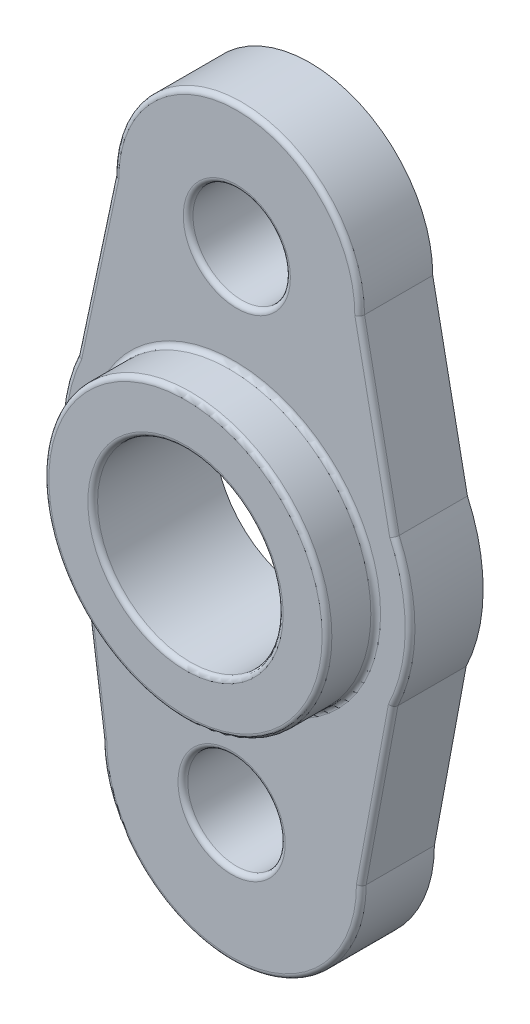
ISO-10303-21;
HEADER;
FILE_DESCRIPTION(('STEP AP214'),'2;1');
FILE_NAME('part.step','',(''),(''),'','','');
FILE_SCHEMA(('AUTOMOTIVE_DESIGN { 1 0 10303 214 1 1 1 1 }'));
ENDSEC;
DATA;
#1=APPLICATION_CONTEXT('core data for automotive mechanical design processes');
#2=APPLICATION_PROTOCOL_DEFINITION('international standard','automotive_design',2000,#1);
#3=PRODUCT_CONTEXT('',#1,'mechanical');
#4=PRODUCT('Part','Part','',(#3));
#5=PRODUCT_RELATED_PRODUCT_CATEGORY('part','',(#4));
#6=PRODUCT_DEFINITION_FORMATION('','',#4);
#7=PRODUCT_DEFINITION_CONTEXT('part definition',#1,'design');
#8=PRODUCT_DEFINITION('design','',#6,#7);
#9=PRODUCT_DEFINITION_SHAPE('','',#8);
#10=(LENGTH_UNIT() NAMED_UNIT(*) SI_UNIT(.MILLI.,.METRE.));
#11=(NAMED_UNIT(*) PLANE_ANGLE_UNIT() SI_UNIT($,.RADIAN.));
#12=(NAMED_UNIT(*) SI_UNIT($,.STERADIAN.) SOLID_ANGLE_UNIT());
#13=UNCERTAINTY_MEASURE_WITH_UNIT(LENGTH_MEASURE(1.E-05),#10,'distance_accuracy_value','');
#14=(GEOMETRIC_REPRESENTATION_CONTEXT(3) GLOBAL_UNCERTAINTY_ASSIGNED_CONTEXT((#13)) GLOBAL_UNIT_ASSIGNED_CONTEXT((#10,
#11,#12)) REPRESENTATION_CONTEXT('',''));
#15=CARTESIAN_POINT('',(0.,0.,0.));
#16=DIRECTION('',(0.,0.,1.));
#17=DIRECTION('',(1.,0.,0.));
#18=AXIS2_PLACEMENT_3D('',#15,#16,#17);
#19=CARTESIAN_POINT('',(1.07039256581862,101.186951407193,15.));
#20=DIRECTION('',(0.,0.,1.));
#21=DIRECTION('',(1.,0.,0.));
#22=AXIS2_PLACEMENT_3D('',#19,#20,#21);
#23=PLANE('',#22);
#24=CARTESIAN_POINT('',(0.535196282909309,50.5934757035965,15.));
#25=DIRECTION('',(0.,0.,1.));
#26=DIRECTION('',(1.,0.,0.));
#27=AXIS2_PLACEMENT_3D('',#24,#25,#26);
#28=CIRCLE('',#27,30.05);
#29=CARTESIAN_POINT('',(30.5851962829093,50.5934757035965,15.));
#30=VERTEX_POINT('',#29);
#31=EDGE_CURVE('E252',#30,#30,#28,.F.);
#32=ORIENTED_EDGE('',*,*,#31,.T.);
#33=EDGE_LOOP('',(#32));
#34=FACE_BOUND('',#33,.T.);
#35=CARTESIAN_POINT('',(0.,0.,15.));
#36=DIRECTION('',(0.,0.,1.));
#37=DIRECTION('',(1.,0.,0.));
#38=AXIS2_PLACEMENT_3D('',#35,#36,#37);
#39=CIRCLE('',#38,11.);
#40=CARTESIAN_POINT('',(11.,0.,15.));
#41=VERTEX_POINT('',#40);
#42=EDGE_CURVE('E248',#41,#41,#39,.F.);
#43=ORIENTED_EDGE('',*,*,#42,.T.);
#44=EDGE_LOOP('',(#43));
#45=FACE_BOUND('',#44,.T.);
#46=CARTESIAN_POINT('',(0.535196282909309,50.5934757035965,15.));
#47=DIRECTION('',(0.,0.,1.));
#48=DIRECTION('',(1.,0.,0.));
#49=AXIS2_PLACEMENT_3D('',#46,#47,#48);
#50=CIRCLE('',#49,35.1077947521401);
#51=CARTESIAN_POINT('',(32.1948458179262,35.4203467026851,15.));
#52=VERTEX_POINT('',#51);
#53=CARTESIAN_POINT('',(32.4572065932217,65.2065694933011,15.));
#54=VERTEX_POINT('',#53);
#55=EDGE_CURVE('E241',#52,#54,#50,.T.);
#56=ORIENTED_EDGE('',*,*,#55,.T.);
#57=DIRECTION('',(-0.19570487620097,0.980662837794501,0.));
#58=VECTOR('',#57,1.);
#59=CARTESIAN_POINT('',(25.3158777698484,100.991246530992,15.));
#60=LINE('',#59,#58);
#61=CARTESIAN_POINT('',(25.2963431259839,101.08913320433,15.));
#62=VERTEX_POINT('',#61);
#63=EDGE_CURVE('E244',#54,#62,#60,.T.);
#64=ORIENTED_EDGE('',*,*,#63,.T.);
#65=CARTESIAN_POINT('',(1.07039256581862,101.186951407193,15.));
#66=DIRECTION('',(0.,0.,1.));
#67=DIRECTION('',(1.,0.,0.));
#68=AXIS2_PLACEMENT_3D('',#65,#66,#67);
#69=CIRCLE('',#68,24.2261480418242);
#70=CARTESIAN_POINT('',(-23.1555318658943,101.082863111398,15.));
#71=VERTEX_POINT('',#70);
#72=EDGE_CURVE('E223',#62,#71,#69,.T.);
#73=ORIENTED_EDGE('',*,*,#72,.T.);
#74=DIRECTION('',(-0.207980763262498,-0.978132916383427,0.));
#75=VECTOR('',#74,1.);
#76=CARTESIAN_POINT('',(-30.7564881804849,65.3355879756199,15.));
#77=LINE('',#76,#75);
#78=CARTESIAN_POINT('',(-30.7800844624881,65.2246147309334,15.));
#79=VERTEX_POINT('',#78);
#80=EDGE_CURVE('E226',#71,#79,#77,.T.);
#81=ORIENTED_EDGE('',*,*,#80,.T.);
#82=CARTESIAN_POINT('',(0.535196282909309,50.5934757035965,15.));
#83=DIRECTION('',(0.,0.,1.));
#84=DIRECTION('',(1.,0.,0.));
#85=AXIS2_PLACEMENT_3D('',#82,#83,#84);
#86=CIRCLE('',#85,34.5646790437915);
#87=CARTESIAN_POINT('',(-30.5125480233978,35.402866404082,15.));
#88=VERTEX_POINT('',#87);
#89=EDGE_CURVE('E229',#79,#88,#86,.T.);
#90=ORIENTED_EDGE('',*,*,#89,.T.);
#91=DIRECTION('',(0.136791732421223,-0.990599829366632,0.));
#92=VECTOR('',#91,1.);
#93=CARTESIAN_POINT('',(-25.6426628215024,0.136791732421204,15.));
#94=LINE('',#93,#92);
#95=CARTESIAN_POINT('',(-25.633172284357,0.0680644467120501,15.));
#96=VERTEX_POINT('',#95);
#97=EDGE_CURVE('E232',#88,#96,#94,.T.);
#98=ORIENTED_EDGE('',*,*,#97,.T.);
#99=CARTESIAN_POINT('',(0.,0.,15.));
#100=DIRECTION('',(0.,0.,1.));
#101=DIRECTION('',(1.,0.,0.));
#102=AXIS2_PLACEMENT_3D('',#99,#100,#101);
#103=CIRCLE('',#102,25.633262650869);
#104=CARTESIAN_POINT('',(25.6331003935999,0.091204934419325,15.));
#105=VERTEX_POINT('',#104);
#106=EDGE_CURVE('E235',#96,#105,#103,.T.);
#107=ORIENTED_EDGE('',*,*,#106,.T.);
#108=DIRECTION('',(0.182608848415609,0.983185642938466,0.));
#109=VECTOR('',#108,1.);
#110=CARTESIAN_POINT('',(32.1708403209182,35.2910985298026,15.));
#111=LINE('',#110,#109);
#112=EDGE_CURVE('E238',#105,#52,#111,.T.);
#113=ORIENTED_EDGE('',*,*,#112,.T.);
#114=EDGE_LOOP('',(#56,#64,#73,#81,#90,#98,#107,#113));
#115=FACE_BOUND('',#114,.T.);
#116=CARTESIAN_POINT('',(1.07039256581862,101.186951407193,15.));
#117=DIRECTION('',(0.,0.,1.));
#118=DIRECTION('',(1.,0.,0.));
#119=AXIS2_PLACEMENT_3D('',#116,#117,#118);
#120=CIRCLE('',#119,11.);
#121=CARTESIAN_POINT('',(12.0703925658186,101.186951407193,15.));
#122=VERTEX_POINT('',#121);
#123=EDGE_CURVE('E219',#122,#122,#120,.F.);
#124=ORIENTED_EDGE('',*,*,#123,.T.);
#125=EDGE_LOOP('',(#124));
#126=FACE_BOUND('',#125,.T.);
#127=ADVANCED_FACE('F51',(#34,#45,#115,#126),#23,.T.);
#128=CARTESIAN_POINT('',(1.07039256581862,101.186951407193,0.));
#129=DIRECTION('',(0.,0.,1.));
#130=DIRECTION('',(1.,0.,0.));
#131=AXIS2_PLACEMENT_3D('',#128,#129,#130);
#132=PLANE('',#131);
#133=CARTESIAN_POINT('',(1.07039256581862,101.186951407193,0.));
#134=DIRECTION('',(0.,0.,1.));
#135=DIRECTION('',(1.,0.,0.));
#136=AXIS2_PLACEMENT_3D('',#133,#134,#135);
#137=CIRCLE('',#136,25.2261480418242);
#138=CARTESIAN_POINT('',(26.2965406076429,101.186951407193,0.));
#139=VERTEX_POINT('',#138);
#140=CARTESIAN_POINT('',(-24.1557554760056,101.186951407193,0.));
#141=VERTEX_POINT('',#140);
#142=EDGE_CURVE('E157',#139,#141,#137,.T.);
#143=ORIENTED_EDGE('',*,*,#142,.F.);
#144=DIRECTION('',(-0.19570487620097,0.980662837794501,0.));
#145=VECTOR('',#144,1.);
#146=CARTESIAN_POINT('',(26.2965406076429,101.186951407193,0.));
#147=LINE('',#146,#145);
#148=CARTESIAN_POINT('',(33.4151955984958,65.5158912878679,0.));
#149=VERTEX_POINT('',#148);
#150=EDGE_CURVE('E194',#149,#139,#147,.T.);
#151=ORIENTED_EDGE('',*,*,#150,.F.);
#152=CARTESIAN_POINT('',(0.535196282909309,50.5934757035965,0.));
#153=DIRECTION('',(0.,0.,1.));
#154=DIRECTION('',(1.,0.,0.));
#155=AXIS2_PLACEMENT_3D('',#152,#153,#154);
#156=CIRCLE('',#155,36.1077947521401);
#157=CARTESIAN_POINT('',(33.1540259638567,35.108489681387,0.));
#158=VERTEX_POINT('',#157);
#159=EDGE_CURVE('E190',#158,#149,#156,.T.);
#160=ORIENTED_EDGE('',*,*,#159,.F.);
#161=DIRECTION('',(0.182608848415609,0.983185642938466,0.));
#162=VECTOR('',#161,1.);
#163=CARTESIAN_POINT('',(26.633262650869,0.,0.));
#164=LINE('',#163,#162);
#165=CARTESIAN_POINT('',(26.633262650869,0.,0.));
#166=VERTEX_POINT('',#165);
#167=EDGE_CURVE('E186',#166,#158,#164,.T.);
#168=ORIENTED_EDGE('',*,*,#167,.F.);
#169=CARTESIAN_POINT('',(0.,0.,0.));
#170=DIRECTION('',(0.,0.,1.));
#171=DIRECTION('',(1.,0.,0.));
#172=AXIS2_PLACEMENT_3D('',#169,#170,#171);
#173=CIRCLE('',#172,26.633262650869);
#174=CARTESIAN_POINT('',(-26.633262650869,0.,0.));
#175=VERTEX_POINT('',#174);
#176=EDGE_CURVE('E182',#175,#166,#173,.T.);
#177=ORIENTED_EDGE('',*,*,#176,.F.);
#178=DIRECTION('',(0.136791732421223,-0.990599829366632,0.));
#179=VECTOR('',#178,1.);
#180=CARTESIAN_POINT('',(-26.633262650869,0.,0.));
#181=LINE('',#180,#179);
#182=CARTESIAN_POINT('',(-31.481386972958,35.108489681387,0.));
#183=VERTEX_POINT('',#182);
#184=EDGE_CURVE('E178',#183,#175,#181,.T.);
#185=ORIENTED_EDGE('',*,*,#184,.F.);
#186=CARTESIAN_POINT('',(0.535196282909309,50.5934757035965,0.));
#187=DIRECTION('',(0.,0.,1.));
#188=DIRECTION('',(1.,0.,0.));
#189=AXIS2_PLACEMENT_3D('',#186,#187,#188);
#190=CIRCLE('',#189,35.5646790437915);
#191=CARTESIAN_POINT('',(-31.7346210968683,65.5435687388824,0.));
#192=VERTEX_POINT('',#191);
#193=EDGE_CURVE('E160',#192,#183,#190,.T.);
#194=ORIENTED_EDGE('',*,*,#193,.F.);
#195=DIRECTION('',(-0.207980763262498,-0.978132916383427,0.));
#196=VECTOR('',#195,1.);
#197=CARTESIAN_POINT('',(-24.1557554760056,101.186951407193,0.));
#198=LINE('',#197,#196);
#199=EDGE_CURVE('E143',#141,#192,#198,.T.);
#200=ORIENTED_EDGE('',*,*,#199,.F.);
#201=EDGE_LOOP('',(#143,#151,#160,#168,#177,#185,#194,#200));
#202=FACE_BOUND('',#201,.T.);
#203=CARTESIAN_POINT('',(1.07039256581862,101.186951407193,0.));
#204=DIRECTION('',(0.,0.,1.));
#205=DIRECTION('',(1.,0.,0.));
#206=AXIS2_PLACEMENT_3D('',#203,#204,#205);
#207=CIRCLE('',#206,10.);
#208=CARTESIAN_POINT('',(11.0703925658186,101.186951407193,0.));
#209=VERTEX_POINT('',#208);
#210=EDGE_CURVE('E168',#209,#209,#207,.T.);
#211=ORIENTED_EDGE('',*,*,#210,.T.);
#212=EDGE_LOOP('',(#211));
#213=FACE_BOUND('',#212,.T.);
#214=CARTESIAN_POINT('',(0.,0.,0.));
#215=DIRECTION('',(0.,0.,1.));
#216=DIRECTION('',(1.,0.,0.));
#217=AXIS2_PLACEMENT_3D('',#214,#215,#216);
#218=CIRCLE('',#217,10.);
#219=CARTESIAN_POINT('',(10.,0.,0.));
#220=VERTEX_POINT('',#219);
#221=EDGE_CURVE('E172',#220,#220,#218,.T.);
#222=ORIENTED_EDGE('',*,*,#221,.T.);
#223=EDGE_LOOP('',(#222));
#224=FACE_BOUND('',#223,.T.);
#225=CARTESIAN_POINT('',(0.535196282909309,50.5934757035965,0.));
#226=DIRECTION('',(0.,0.,1.));
#227=DIRECTION('',(1.,0.,0.));
#228=AXIS2_PLACEMENT_3D('',#225,#226,#227);
#229=CIRCLE('',#228,19.05);
#230=CARTESIAN_POINT('',(19.5851962829093,50.5934757035965,0.));
#231=VERTEX_POINT('',#230);
#232=EDGE_CURVE('E382',#231,#231,#229,.T.);
#233=ORIENTED_EDGE('',*,*,#232,.T.);
#234=EDGE_LOOP('',(#233));
#235=FACE_BOUND('',#234,.T.);
#236=ADVANCED_FACE('F154',(#202,#213,#224,#235),#132,.F.);
#237=CARTESIAN_POINT('',(1.07039256581862,101.186951407193,15.));
#238=DIRECTION('',(0.,0.,-1.));
#239=DIRECTION('',(-1.,0.,0.));
#240=AXIS2_PLACEMENT_3D('',#237,#238,#239);
#241=CYLINDRICAL_SURFACE('',#240,25.2261480418242);
#242=DIRECTION('',(0.,0.,-1.));
#243=VECTOR('',#242,1.);
#244=CARTESIAN_POINT('',(-24.1557554760056,101.186951407193,15.));
#245=LINE('',#244,#243);
#246=CARTESIAN_POINT('',(-24.1557554760056,101.186951407193,14.));
#247=VERTEX_POINT('',#246);
#248=EDGE_CURVE('E140',#247,#141,#245,.T.);
#249=ORIENTED_EDGE('',*,*,#248,.F.);
#250=CARTESIAN_POINT('',(1.07039256581862,101.186951407193,14.));
#251=DIRECTION('',(0.,0.,1.));
#252=DIRECTION('',(1.,0.,0.));
#253=AXIS2_PLACEMENT_3D('',#250,#251,#252);
#254=CIRCLE('',#253,25.2261480418242);
#255=CARTESIAN_POINT('',(26.2965406076429,101.186951407193,14.));
#256=VERTEX_POINT('',#255);
#257=EDGE_CURVE('E280',#247,#256,#254,.F.);
#258=ORIENTED_EDGE('',*,*,#257,.T.);
#259=DIRECTION('',(0.,0.,-1.));
#260=VECTOR('',#259,1.);
#261=CARTESIAN_POINT('',(26.2965406076429,101.186951407193,15.));
#262=LINE('',#261,#260);
#263=EDGE_CURVE('E165',#256,#139,#262,.T.);
#264=ORIENTED_EDGE('',*,*,#263,.T.);
#265=ORIENTED_EDGE('',*,*,#142,.T.);
#266=EDGE_LOOP('',(#249,#258,#264,#265));
#267=FACE_BOUND('',#266,.T.);
#268=ADVANCED_FACE('F163',(#267),#241,.T.);
#269=CARTESIAN_POINT('',(-24.1557554760056,101.186951407193,15.));
#270=DIRECTION('',(0.978132916383427,-0.207980763262498,0.));
#271=DIRECTION('',(0.207980763262498,0.978132916383427,0.));
#272=AXIS2_PLACEMENT_3D('',#269,#270,#271);
#273=PLANE('',#272);
#274=DIRECTION('',(0.,0.,-1.));
#275=VECTOR('',#274,1.);
#276=CARTESIAN_POINT('',(-31.7346210968683,65.5435687388824,15.));
#277=LINE('',#276,#275);
#278=CARTESIAN_POINT('',(-31.7346210968683,65.5435687388824,14.));
#279=VERTEX_POINT('',#278);
#280=EDGE_CURVE('E150',#279,#192,#277,.T.);
#281=ORIENTED_EDGE('',*,*,#280,.F.);
#282=DIRECTION('',(-0.207980763262498,-0.978132916383427,0.));
#283=VECTOR('',#282,1.);
#284=CARTESIAN_POINT('',(-24.1557554760056,101.186951407193,14.));
#285=LINE('',#284,#283);
#286=EDGE_CURVE('E67',#279,#247,#285,.F.);
#287=ORIENTED_EDGE('',*,*,#286,.T.);
#288=ORIENTED_EDGE('',*,*,#248,.T.);
#289=ORIENTED_EDGE('',*,*,#199,.T.);
#290=EDGE_LOOP('',(#281,#287,#288,#289));
#291=FACE_BOUND('',#290,.T.);
#292=ADVANCED_FACE('F142',(#291),#273,.F.);
#293=CARTESIAN_POINT('',(0.535196282909309,50.5934757035965,15.));
#294=DIRECTION('',(0.,0.,-1.));
#295=DIRECTION('',(-1.,0.,0.));
#296=AXIS2_PLACEMENT_3D('',#293,#294,#295);
#297=CYLINDRICAL_SURFACE('',#296,35.5646790437915);
#298=DIRECTION('',(0.,0.,-1.));
#299=VECTOR('',#298,1.);
#300=CARTESIAN_POINT('',(-31.481386972958,35.108489681387,15.));
#301=LINE('',#300,#299);
#302=CARTESIAN_POINT('',(-31.481386972958,35.108489681387,14.));
#303=VERTEX_POINT('',#302);
#304=EDGE_CURVE('E211',#303,#183,#301,.T.);
#305=ORIENTED_EDGE('',*,*,#304,.F.);
#306=CARTESIAN_POINT('',(0.535196282909309,50.5934757035965,14.));
#307=DIRECTION('',(0.,0.,1.));
#308=DIRECTION('',(1.,0.,0.));
#309=AXIS2_PLACEMENT_3D('',#306,#307,#308);
#310=CIRCLE('',#309,35.5646790437915);
#311=EDGE_CURVE('E75',#303,#279,#310,.F.);
#312=ORIENTED_EDGE('',*,*,#311,.T.);
#313=ORIENTED_EDGE('',*,*,#280,.T.);
#314=ORIENTED_EDGE('',*,*,#193,.T.);
#315=EDGE_LOOP('',(#305,#312,#313,#314));
#316=FACE_BOUND('',#315,.T.);
#317=ADVANCED_FACE('F454',(#316),#297,.T.);
#318=CARTESIAN_POINT('',(-26.633262650869,0.,15.));
#319=DIRECTION('',(0.990599829366632,0.136791732421223,0.));
#320=DIRECTION('',(-0.136791732421223,0.990599829366632,0.));
#321=AXIS2_PLACEMENT_3D('',#318,#319,#320);
#322=PLANE('',#321);
#323=DIRECTION('',(0.,0.,-1.));
#324=VECTOR('',#323,1.);
#325=CARTESIAN_POINT('',(-26.633262650869,0.,15.));
#326=LINE('',#325,#324);
#327=CARTESIAN_POINT('',(-26.633262650869,0.,14.));
#328=VERTEX_POINT('',#327);
#329=EDGE_CURVE('E208',#328,#175,#326,.T.);
#330=ORIENTED_EDGE('',*,*,#329,.F.);
#331=DIRECTION('',(0.136791732421223,-0.990599829366632,0.));
#332=VECTOR('',#331,1.);
#333=CARTESIAN_POINT('',(-31.481386972958,35.108489681387,14.));
#334=LINE('',#333,#332);
#335=EDGE_CURVE('E273',#328,#303,#334,.F.);
#336=ORIENTED_EDGE('',*,*,#335,.T.);
#337=ORIENTED_EDGE('',*,*,#304,.T.);
#338=ORIENTED_EDGE('',*,*,#184,.T.);
#339=EDGE_LOOP('',(#330,#336,#337,#338));
#340=FACE_BOUND('',#339,.T.);
#341=ADVANCED_FACE('F450',(#340),#322,.F.);
#342=CARTESIAN_POINT('',(0.,0.,15.));
#343=DIRECTION('',(0.,0.,-1.));
#344=DIRECTION('',(-1.,0.,0.));
#345=AXIS2_PLACEMENT_3D('',#342,#343,#344);
#346=CYLINDRICAL_SURFACE('',#345,26.633262650869);
#347=DIRECTION('',(0.,0.,-1.));
#348=VECTOR('',#347,1.);
#349=CARTESIAN_POINT('',(26.633262650869,0.,15.));
#350=LINE('',#349,#348);
#351=CARTESIAN_POINT('',(26.633262650869,0.,14.));
#352=VERTEX_POINT('',#351);
#353=EDGE_CURVE('E205',#352,#166,#350,.T.);
#354=ORIENTED_EDGE('',*,*,#353,.F.);
#355=CARTESIAN_POINT('',(0.,0.,14.));
#356=DIRECTION('',(0.,0.,1.));
#357=DIRECTION('',(1.,0.,0.));
#358=AXIS2_PLACEMENT_3D('',#355,#356,#357);
#359=CIRCLE('',#358,26.633262650869);
#360=EDGE_CURVE('E270',#352,#328,#359,.F.);
#361=ORIENTED_EDGE('',*,*,#360,.T.);
#362=ORIENTED_EDGE('',*,*,#329,.T.);
#363=ORIENTED_EDGE('',*,*,#176,.T.);
#364=EDGE_LOOP('',(#354,#361,#362,#363));
#365=FACE_BOUND('',#364,.T.);
#366=ADVANCED_FACE('F446',(#365),#346,.T.);
#367=CARTESIAN_POINT('',(26.633262650869,0.,15.));
#368=DIRECTION('',(-0.983185642938466,0.182608848415609,0.));
#369=DIRECTION('',(-0.182608848415609,-0.983185642938466,0.));
#370=AXIS2_PLACEMENT_3D('',#367,#368,#369);
#371=PLANE('',#370);
#372=DIRECTION('',(0.,0.,-1.));
#373=VECTOR('',#372,1.);
#374=CARTESIAN_POINT('',(33.1540259638567,35.108489681387,15.));
#375=LINE('',#374,#373);
#376=CARTESIAN_POINT('',(33.1540259638567,35.108489681387,14.));
#377=VERTEX_POINT('',#376);
#378=EDGE_CURVE('E202',#377,#158,#375,.T.);
#379=ORIENTED_EDGE('',*,*,#378,.F.);
#380=DIRECTION('',(0.182608848415609,0.983185642938466,0.));
#381=VECTOR('',#380,1.);
#382=CARTESIAN_POINT('',(26.633262650869,0.,14.));
#383=LINE('',#382,#381);
#384=EDGE_CURVE('E267',#377,#352,#383,.F.);
#385=ORIENTED_EDGE('',*,*,#384,.T.);
#386=ORIENTED_EDGE('',*,*,#353,.T.);
#387=ORIENTED_EDGE('',*,*,#167,.T.);
#388=EDGE_LOOP('',(#379,#385,#386,#387));
#389=FACE_BOUND('',#388,.T.);
#390=ADVANCED_FACE('F442',(#389),#371,.F.);
#391=CARTESIAN_POINT('',(0.535196282909309,50.5934757035965,15.));
#392=DIRECTION('',(0.,0.,-1.));
#393=DIRECTION('',(-1.,0.,0.));
#394=AXIS2_PLACEMENT_3D('',#391,#392,#393);
#395=CYLINDRICAL_SURFACE('',#394,36.1077947521401);
#396=DIRECTION('',(0.,0.,-1.));
#397=VECTOR('',#396,1.);
#398=CARTESIAN_POINT('',(33.4151955984958,65.5158912878679,15.));
#399=LINE('',#398,#397);
#400=CARTESIAN_POINT('',(33.4151955984958,65.5158912878679,14.));
#401=VERTEX_POINT('',#400);
#402=EDGE_CURVE('E199',#401,#149,#399,.T.);
#403=ORIENTED_EDGE('',*,*,#402,.F.);
#404=CARTESIAN_POINT('',(0.535196282909309,50.5934757035965,14.));
#405=DIRECTION('',(0.,0.,1.));
#406=DIRECTION('',(1.,0.,0.));
#407=AXIS2_PLACEMENT_3D('',#404,#405,#406);
#408=CIRCLE('',#407,36.1077947521401);
#409=EDGE_CURVE('E264',#401,#377,#408,.F.);
#410=ORIENTED_EDGE('',*,*,#409,.T.);
#411=ORIENTED_EDGE('',*,*,#378,.T.);
#412=ORIENTED_EDGE('',*,*,#159,.T.);
#413=EDGE_LOOP('',(#403,#410,#411,#412));
#414=FACE_BOUND('',#413,.T.);
#415=ADVANCED_FACE('F438',(#414),#395,.T.);
#416=CARTESIAN_POINT('',(26.2965406076429,101.186951407193,15.));
#417=DIRECTION('',(-0.980662837794501,-0.19570487620097,0.));
#418=DIRECTION('',(0.19570487620097,-0.980662837794501,0.));
#419=AXIS2_PLACEMENT_3D('',#416,#417,#418);
#420=PLANE('',#419);
#421=ORIENTED_EDGE('',*,*,#263,.F.);
#422=DIRECTION('',(-0.19570487620097,0.980662837794501,0.));
#423=VECTOR('',#422,1.);
#424=CARTESIAN_POINT('',(33.4151955984958,65.5158912878679,14.));
#425=LINE('',#424,#423);
#426=EDGE_CURVE('E260',#256,#401,#425,.F.);
#427=ORIENTED_EDGE('',*,*,#426,.T.);
#428=ORIENTED_EDGE('',*,*,#402,.T.);
#429=ORIENTED_EDGE('',*,*,#150,.T.);
#430=EDGE_LOOP('',(#421,#427,#428,#429));
#431=FACE_BOUND('',#430,.T.);
#432=ADVANCED_FACE('F423',(#431),#420,.F.);
#433=CARTESIAN_POINT('',(1.07039256581862,101.186951407193,15.));
#434=DIRECTION('',(0.,0.,-1.));
#435=DIRECTION('',(-1.,0.,0.));
#436=AXIS2_PLACEMENT_3D('',#433,#434,#435);
#437=CYLINDRICAL_SURFACE('',#436,10.);
#438=CARTESIAN_POINT('',(1.07039256581862,101.186951407193,14.));
#439=DIRECTION('',(0.,0.,1.));
#440=DIRECTION('',(1.,0.,0.));
#441=AXIS2_PLACEMENT_3D('',#438,#439,#440);
#442=CIRCLE('',#441,10.);
#443=CARTESIAN_POINT('',(11.0703925658186,101.186951407193,14.));
#444=VERTEX_POINT('',#443);
#445=EDGE_CURVE('E283',#444,#444,#442,.T.);
#446=ORIENTED_EDGE('',*,*,#445,.T.);
#447=EDGE_LOOP('',(#446));
#448=FACE_BOUND('',#447,.T.);
#449=ORIENTED_EDGE('',*,*,#210,.F.);
#450=EDGE_LOOP('',(#449));
#451=FACE_BOUND('',#450,.T.);
#452=ADVANCED_FACE('F417',(#448,#451),#437,.F.);
#453=CARTESIAN_POINT('',(0.,0.,15.));
#454=DIRECTION('',(0.,0.,-1.));
#455=DIRECTION('',(-1.,0.,0.));
#456=AXIS2_PLACEMENT_3D('',#453,#454,#455);
#457=CYLINDRICAL_SURFACE('',#456,10.);
#458=CARTESIAN_POINT('',(0.,0.,14.));
#459=DIRECTION('',(0.,0.,1.));
#460=DIRECTION('',(1.,0.,0.));
#461=AXIS2_PLACEMENT_3D('',#458,#459,#460);
#462=CIRCLE('',#461,10.);
#463=CARTESIAN_POINT('',(10.,0.,14.));
#464=VERTEX_POINT('',#463);
#465=EDGE_CURVE('E256',#464,#464,#462,.T.);
#466=ORIENTED_EDGE('',*,*,#465,.T.);
#467=EDGE_LOOP('',(#466));
#468=FACE_BOUND('',#467,.T.);
#469=ORIENTED_EDGE('',*,*,#221,.F.);
#470=EDGE_LOOP('',(#469));
#471=FACE_BOUND('',#470,.T.);
#472=ADVANCED_FACE('F404',(#468,#471),#457,.F.);
#473=CARTESIAN_POINT('',(0.535196282909309,50.5934757035965,15.));
#474=DIRECTION('',(0.,0.,-1.));
#475=DIRECTION('',(-1.,0.,0.));
#476=AXIS2_PLACEMENT_3D('',#473,#474,#475);
#477=CYLINDRICAL_SURFACE('',#476,19.05);
#478=CARTESIAN_POINT('',(0.535196282909309,50.5934757035965,24.));
#479=DIRECTION('',(0.,0.,1.));
#480=DIRECTION('',(1.,0.,0.));
#481=AXIS2_PLACEMENT_3D('',#478,#479,#480);
#482=CIRCLE('',#481,19.05);
#483=CARTESIAN_POINT('',(19.5851962829093,50.5934757035965,24.));
#484=VERTEX_POINT('',#483);
#485=EDGE_CURVE('E287',#484,#484,#482,.T.);
#486=ORIENTED_EDGE('',*,*,#485,.T.);
#487=EDGE_LOOP('',(#486));
#488=FACE_BOUND('',#487,.T.);
#489=ORIENTED_EDGE('',*,*,#232,.F.);
#490=EDGE_LOOP('',(#489));
#491=FACE_BOUND('',#490,.T.);
#492=ADVANCED_FACE('F401',(#488,#491),#477,.F.);
#493=CARTESIAN_POINT('',(0.535196282909309,50.5934757035965,25.));
#494=DIRECTION('',(0.,0.,1.));
#495=DIRECTION('',(1.,0.,0.));
#496=AXIS2_PLACEMENT_3D('',#493,#494,#495);
#497=PLANE('',#496);
#498=CARTESIAN_POINT('',(0.535196282909309,50.5934757035965,25.));
#499=DIRECTION('',(0.,0.,1.));
#500=DIRECTION('',(1.,0.,0.));
#501=AXIS2_PLACEMENT_3D('',#498,#499,#500);
#502=CIRCLE('',#501,20.05);
#503=CARTESIAN_POINT('',(20.5851962829093,50.5934757035965,25.));
#504=VERTEX_POINT('',#503);
#505=EDGE_CURVE('E60',#504,#504,#502,.F.);
#506=ORIENTED_EDGE('',*,*,#505,.T.);
#507=EDGE_LOOP('',(#506));
#508=FACE_BOUND('',#507,.T.);
#509=CARTESIAN_POINT('',(0.535196282909309,50.5934757035965,25.));
#510=DIRECTION('',(0.,0.,1.));
#511=DIRECTION('',(1.,0.,0.));
#512=AXIS2_PLACEMENT_3D('',#509,#510,#511);
#513=CIRCLE('',#512,28.05);
#514=CARTESIAN_POINT('',(28.5851962829093,50.5934757035965,25.));
#515=VERTEX_POINT('',#514);
#516=EDGE_CURVE('E386',#515,#515,#513,.T.);
#517=ORIENTED_EDGE('',*,*,#516,.T.);
#518=EDGE_LOOP('',(#517));
#519=FACE_BOUND('',#518,.T.);
#520=ADVANCED_FACE('F393',(#508,#519),#497,.T.);
#521=CARTESIAN_POINT('',(0.535196282909309,50.5934757035965,25.));
#522=DIRECTION('',(0.,0.,-1.));
#523=DIRECTION('',(-1.,0.,0.));
#524=AXIS2_PLACEMENT_3D('',#521,#522,#523);
#525=CYLINDRICAL_SURFACE('',#524,29.05);
#526=CARTESIAN_POINT('',(0.535196282909309,50.5934757035965,24.));
#527=DIRECTION('',(0.,0.,1.));
#528=DIRECTION('',(1.,0.,0.));
#529=AXIS2_PLACEMENT_3D('',#526,#527,#528);
#530=CIRCLE('',#529,29.05);
#531=CARTESIAN_POINT('',(29.5851962829093,50.5934757035965,24.));
#532=VERTEX_POINT('',#531);
#533=EDGE_CURVE('E11',#532,#532,#530,.F.);
#534=ORIENTED_EDGE('',*,*,#533,.T.);
#535=EDGE_LOOP('',(#534));
#536=FACE_BOUND('',#535,.T.);
#537=CARTESIAN_POINT('',(0.535196282909309,50.5934757035965,16.));
#538=DIRECTION('',(0.,0.,1.));
#539=DIRECTION('',(1.,0.,0.));
#540=AXIS2_PLACEMENT_3D('',#537,#538,#539);
#541=CIRCLE('',#540,29.05);
#542=CARTESIAN_POINT('',(29.5851962829093,50.5934757035965,16.));
#543=VERTEX_POINT('',#542);
#544=EDGE_CURVE('E149',#543,#543,#541,.T.);
#545=ORIENTED_EDGE('',*,*,#544,.T.);
#546=EDGE_LOOP('',(#545));
#547=FACE_BOUND('',#546,.T.);
#548=ADVANCED_FACE('F464',(#536,#547),#525,.T.);
#549=CARTESIAN_POINT('',(0.535196282909309,50.5934757035965,16.));
#550=DIRECTION('',(0.,0.,1.));
#551=DIRECTION('',(1.,0.,0.));
#552=AXIS2_PLACEMENT_3D('',#549,#550,#551);
#553=TOROIDAL_SURFACE('',#552,30.05,1.);
#554=ORIENTED_EDGE('',*,*,#31,.F.);
#555=EDGE_LOOP('',(#554));
#556=FACE_BOUND('',#555,.T.);
#557=ORIENTED_EDGE('',*,*,#544,.F.);
#558=EDGE_LOOP('',(#557));
#559=FACE_BOUND('',#558,.T.);
#560=ADVANCED_FACE('F461',(#556,#559),#553,.F.);
#561=CARTESIAN_POINT('',(0.,0.,14.));
#562=DIRECTION('',(0.,0.,1.));
#563=DIRECTION('',(1.,0.,0.));
#564=AXIS2_PLACEMENT_3D('',#561,#562,#563);
#565=TOROIDAL_SURFACE('',#564,11.,1.);
#566=ORIENTED_EDGE('',*,*,#42,.F.);
#567=EDGE_LOOP('',(#566));
#568=FACE_BOUND('',#567,.T.);
#569=ORIENTED_EDGE('',*,*,#465,.F.);
#570=EDGE_LOOP('',(#569));
#571=FACE_BOUND('',#570,.T.);
#572=ADVANCED_FACE('F463',(#568,#571),#565,.T.);
#573=CARTESIAN_POINT('',(-38.8356981917376,95.6763273115126,14.));
#574=DIRECTION('',(-0.136791732421223,0.990599829366632,0.));
#575=DIRECTION('',(-0.990599829366632,-0.136791732421223,0.));
#576=AXIS2_PLACEMENT_3D('',#573,#574,#575);
#577=CYLINDRICAL_SURFACE('',#576,1.);
#578=CARTESIAN_POINT('',(-31.481386972958,35.108489681387,14.));
#579=CARTESIAN_POINT('',(-31.4813869702048,35.1084896977985,14.0278827622707));
#580=CARTESIAN_POINT('',(-31.4802562310566,35.1088318592423,14.055752079046));
#581=CARTESIAN_POINT('',(-31.4757464449589,35.1101966205296,14.11128939228));
#582=CARTESIAN_POINT('',(-31.4723675599593,35.1112191713598,14.138957403095));
#583=CARTESIAN_POINT('',(-31.4588954877916,35.1152964689785,14.2212981574));
#584=CARTESIAN_POINT('',(-31.4454667662205,35.1193608954155,14.2754162338411));
#585=CARTESIAN_POINT('',(-31.4101147124109,35.1300637140492,14.3805219207951));
#586=CARTESIAN_POINT('',(-31.3881883444233,35.1367030261138,14.4315084050099));
#587=CARTESIAN_POINT('',(-31.3365003028755,35.1523600445421,14.5289386611563));
#588=CARTESIAN_POINT('',(-31.3067396832495,35.1613774309862,14.5753830429805));
#589=CARTESIAN_POINT('',(-31.2400812428465,35.1815841125667,14.6626909402743));
#590=CARTESIAN_POINT('',(-31.2031465891116,35.19278461736,14.7035237133594));
#591=CARTESIAN_POINT('',(-31.1232998117005,35.2170114679433,14.7782331442182));
#592=CARTESIAN_POINT('',(-31.0803856872644,35.2300384248824,14.8121074642337));
#593=CARTESIAN_POINT('',(-30.9892742566832,35.2577128683713,14.8723492801353));
#594=CARTESIAN_POINT('',(-30.9410204762948,35.2723776965248,14.8986232685733));
#595=CARTESIAN_POINT('',(-30.8410289787351,35.3027863173322,14.9424222781868));
#596=CARTESIAN_POINT('',(-30.7892935031669,35.3185294158821,14.9599528685669));
#597=CARTESIAN_POINT('',(-30.7016150320308,35.3452283785757,14.9814717993503));
#598=CARTESIAN_POINT('',(-30.666224995546,35.3560097719148,14.9880328991713));
#599=CARTESIAN_POINT('',(-30.5950101822155,35.377715004825,14.9970556252775));
#600=CARTESIAN_POINT('',(-30.5591862260315,35.3886385777511,14.9995240494749));
#601=CARTESIAN_POINT('',(-30.5197623180551,35.400665422999,14.9999792478716));
#602=CARTESIAN_POINT('',(-30.5161550034381,35.401765938855,15.0000000545377));
#603=CARTESIAN_POINT('',(-30.5125480233977,35.402866404082,15.));
#604=B_SPLINE_CURVE_WITH_KNOTS('',3,(#578,#579,#580,#581,#582,#583,#584,#585,#586,#587,#588,
#589,#590,#591,#592,#593,#594,#595,#596,#597,#598,#599,#600,#601,#602,#603),.UNSPECIFIED.,.F.,
.F.,(4,2,2,2,2,2,2,2,2,2,2,2,4),(0.,0.0835966099292529,0.16718719845407,0.334046713049229,
0.500965892546928,0.667862628040462,0.83564004540632,1.00347373733211,1.17329211489616,
1.34300218617137,1.45552460195559,1.56785993068326,1.5791741893936),.UNSPECIFIED.);
#605=EDGE_CURVE('E359',#303,#88,#604,.T.);
#606=ORIENTED_EDGE('',*,*,#605,.F.);
#607=ORIENTED_EDGE('',*,*,#335,.F.);
#608=CARTESIAN_POINT('',(-26.633262650869,0.,14.));
#609=CARTESIAN_POINT('',(-26.633262497384,1.70989262816304E-09,14.0280854209805));
#610=CARTESIAN_POINT('',(-26.6320787191466,8.13593958746815E-05,14.0561573696844));
#611=CARTESIAN_POINT('',(-26.6273563734737,0.000405855335008347,14.1121000415608));
#612=CARTESIAN_POINT('',(-26.6238179295637,0.000648985101614962,14.1399707752115));
#613=CARTESIAN_POINT('',(-26.6097046163335,0.00161858251974936,14.2229329843483));
#614=CARTESIAN_POINT('',(-26.5956316706153,0.00258526527608143,14.2774681267117));
#615=CARTESIAN_POINT('',(-26.5585535520311,0.00513052198047515,14.3833933666926));
#616=CARTESIAN_POINT('',(-26.5355443218369,0.0067093738702539,14.4347820234293));
#617=CARTESIAN_POINT('',(-26.4812571788235,0.0104311032715333,14.532959434402));
#618=CARTESIAN_POINT('',(-26.4499810745882,0.0125738574149666,14.5797491916935));
#619=CARTESIAN_POINT('',(-26.3800180841833,0.0173617155634073,14.66745687882));
#620=CARTESIAN_POINT('',(-26.3413239798785,0.0200073088377792,14.7083690210063));
#621=CARTESIAN_POINT('',(-26.25763054242,0.0257220684863284,14.783133375333));
#622=CARTESIAN_POINT('',(-26.2126290494424,0.0287913799478549,14.8169831592047));
#623=CARTESIAN_POINT('',(-26.1174963086317,0.0352702960621304,14.8767321463927));
#624=CARTESIAN_POINT('',(-26.0673524626944,0.0386807359069249,14.902611170669));
#625=CARTESIAN_POINT('',(-25.9634673300631,0.0457349214108227,14.9455634045098));
#626=CARTESIAN_POINT('',(-25.9097292243395,0.0493784606526633,14.9626442870301));
#627=CARTESIAN_POINT('',(-25.8213503656591,0.0553606211419972,14.9827486201636));
#628=CARTESIAN_POINT('',(-25.7873320914881,0.0576609237110835,14.988652755827));
#629=CARTESIAN_POINT('',(-25.718902379369,0.0622832800521006,14.9969132968836));
#630=CARTESIAN_POINT('',(-25.6844916190122,0.0646052953673252,14.9992750910394));
#631=CARTESIAN_POINT('',(-25.6444387230894,0.0673051922716487,14.9999525187153));
#632=CARTESIAN_POINT('',(-25.6388051543352,0.0676848759673791,15.0000001261958));
#633=CARTESIAN_POINT('',(-25.6331722843572,0.0680644467120244,15.));
#634=B_SPLINE_CURVE_WITH_KNOTS('',3,(#608,#609,#610,#611,#612,#613,#614,#615,#616,#617,#618,
#619,#620,#621,#622,#623,#624,#625,#626,#627,#628,#629,#630,#631,#632,#633),.UNSPECIFIED.,.F.,
.F.,(4,2,2,2,2,2,2,2,2,2,2,2,4),(0.,0.0842044541817178,0.168404491355562,0.33652716968004,
0.504726269903549,0.672888602810625,0.8412154054703,1.0095999893334,1.17840742224638,
1.34706738602012,1.4507204520072,1.55421567598021,1.57115438775747),.UNSPECIFIED.);
#635=EDGE_CURVE('E374',#96,#328,#634,.F.);
#636=ORIENTED_EDGE('',*,*,#635,.F.);
#637=ORIENTED_EDGE('',*,*,#97,.F.);
#638=EDGE_LOOP('',(#606,#607,#636,#637));
#639=FACE_BOUND('',#638,.T.);
#640=ADVANCED_FACE('F369',(#639),#577,.T.);
#641=CARTESIAN_POINT('',(0.,0.,14.));
#642=DIRECTION('',(0.,0.,1.));
#643=DIRECTION('',(1.,0.,0.));
#644=AXIS2_PLACEMENT_3D('',#641,#642,#643);
#645=TOROIDAL_SURFACE('',#644,25.633262650869,1.);
#646=ORIENTED_EDGE('',*,*,#635,.T.);
#647=ORIENTED_EDGE('',*,*,#360,.F.);
#648=CARTESIAN_POINT('',(26.633262650869,0.,14.));
#649=CARTESIAN_POINT('',(26.6332625244207,-1.81063933321797E-10,14.0280472143986));
#650=CARTESIAN_POINT('',(26.6320819358635,0.000108719813177079,14.0560809618164));
#651=CARTESIAN_POINT('',(26.6273724954427,0.000542333857302695,14.1119472160871));
#652=CARTESIAN_POINT('',(26.6238437753443,0.000867215777284766,14.1397797341433));
#653=CARTESIAN_POINT('',(26.6097701733891,0.00216275384286983,14.222624761106));
#654=CARTESIAN_POINT('',(26.5957377503249,0.00345431210240917,14.2770812581981));
#655=CARTESIAN_POINT('',(26.5587717546886,0.00685446525083324,14.3828519793588));
#656=CARTESIAN_POINT('',(26.5358343022374,0.00896341627319926,14.4341648224541));
#657=CARTESIAN_POINT('',(26.481724645091,0.0139339664436774,14.532201493666));
#658=CARTESIAN_POINT('',(26.4505541046438,0.01679541348067,14.5789262466102));
#659=CARTESIAN_POINT('',(26.3808093799398,0.0231907874260956,14.6665592474698));
#660=CARTESIAN_POINT('',(26.3422220350597,0.0267259096293385,14.7074569275867));
#661=CARTESIAN_POINT('',(26.25876650388,0.0343614986771569,14.7822118934647));
#662=CARTESIAN_POINT('',(26.2138961963589,0.0384621564478503,14.8160667918432));
#663=CARTESIAN_POINT('',(26.1189623990191,0.047125255614523,14.8759096013502));
#664=CARTESIAN_POINT('',(26.0688776087343,0.0516895890639214,14.9018633986318));
#665=CARTESIAN_POINT('',(25.9651079052902,0.061131092205271,14.9449763564739));
#666=CARTESIAN_POINT('',(25.9114259528582,0.0660080044815937,14.9621426516381));
#667=CARTESIAN_POINT('',(25.8224325883949,0.0740792565797051,14.9825563937347));
#668=CARTESIAN_POINT('',(25.7877308835792,0.0772232892658322,14.988606890648));
#669=CARTESIAN_POINT('',(25.7179206903891,0.0835414423833978,14.997016079955));
#670=CARTESIAN_POINT('',(25.6828129241468,0.0867155079865224,14.9993805389333));
#671=CARTESIAN_POINT('',(25.6428343497074,0.0903260417412923,14.9999645696936));
#672=CARTESIAN_POINT('',(25.637967105046,0.0907655451965274,15.0000000936993));
#673=CARTESIAN_POINT('',(25.6331003936001,0.0912049344193171,15.));
#674=B_SPLINE_CURVE_WITH_KNOTS('',3,(#648,#649,#650,#651,#652,#653,#654,#655,#656,#657,#658,
#659,#660,#661,#662,#663,#664,#665,#666,#667,#668,#669,#670,#671,#672,#673),.UNSPECIFIED.,.F.,
.F.,(4,2,2,2,2,2,2,2,2,2,2,2,4),(0.,0.0840898600644685,0.16817500183367,0.336059431605181,
0.504017090064709,0.671940823274073,0.840165323603418,1.00844675657644,1.17744478155642,
1.34630537796055,1.4522339671546,1.5579966705409,1.57265759477768),.UNSPECIFIED.);
#675=EDGE_CURVE('E351',#105,#352,#674,.F.);
#676=ORIENTED_EDGE('',*,*,#675,.F.);
#677=ORIENTED_EDGE('',*,*,#106,.F.);
#678=EDGE_LOOP('',(#646,#647,#676,#677));
#679=FACE_BOUND('',#678,.T.);
#680=ADVANCED_FACE('F366',(#679),#645,.T.);
#681=CARTESIAN_POINT('',(0.535196282909309,50.5934757035965,14.));
#682=DIRECTION('',(0.,0.,1.));
#683=DIRECTION('',(1.,0.,0.));
#684=AXIS2_PLACEMENT_3D('',#681,#682,#683);
#685=TOROIDAL_SURFACE('',#684,34.5646790437915,1.);
#686=ORIENTED_EDGE('',*,*,#605,.T.);
#687=ORIENTED_EDGE('',*,*,#89,.F.);
#688=CARTESIAN_POINT('',(-31.7346210968683,65.5435687388824,14.));
#689=CARTESIAN_POINT('',(-31.7346210101105,65.5435686986404,14.0280048459029));
#690=CARTESIAN_POINT('',(-31.733497261486,65.5431942189036,14.055996230355));
#691=CARTESIAN_POINT('',(-31.7290147857467,65.5417003982701,14.111777736359));
#692=CARTESIAN_POINT('',(-31.7256561932668,65.5405811022437,14.139567869933));
#693=CARTESIAN_POINT('',(-31.7122621804557,65.5361171864819,14.2222829168849));
#694=CARTESIAN_POINT('',(-31.6989084243673,65.5316665062461,14.2766521645612));
#695=CARTESIAN_POINT('',(-31.6637369328498,65.5199420447545,14.3822514325937));
#696=CARTESIAN_POINT('',(-31.6419156814439,65.5126670907686,14.4334801386499));
#697=CARTESIAN_POINT('',(-31.5904497270958,65.4955046516335,14.5313605937391));
#698=CARTESIAN_POINT('',(-31.5608064650586,65.4856176476538,14.5780131835767));
#699=CARTESIAN_POINT('',(-31.4944630400156,65.4634830910712,14.6655634551355));
#700=CARTESIAN_POINT('',(-31.4577440379859,65.4512292365647,14.7064452572091));
#701=CARTESIAN_POINT('',(-31.3783407110768,65.4247211887716,14.7811902113292));
#702=CARTESIAN_POINT('',(-31.3356543829918,65.4104663237478,14.8150509969327));
#703=CARTESIAN_POINT('',(-31.245263451536,65.3802685672978,14.8749983675184));
#704=CARTESIAN_POINT('',(-31.1975293473963,65.3643157485292,14.9010353991405));
#705=CARTESIAN_POINT('',(-31.0986295345336,65.3312487303689,14.9443263955977));
#706=CARTESIAN_POINT('',(-31.0474664681816,65.3141354251351,14.9615870374424));
#707=CARTESIAN_POINT('',(-30.962094554076,65.2855666969455,14.9823001916437));
#708=CARTESIAN_POINT('',(-30.9284555703871,65.2743066141794,14.9884895178126));
#709=CARTESIAN_POINT('',(-30.8607801667038,65.2516467621385,14.9970564688108));
#710=CARTESIAN_POINT('',(-30.8267444676151,65.2402472448024,14.9994401681963));
#711=CARTESIAN_POINT('',(-30.7885012714629,65.2274347431482,14.9999708976809));
#712=CARTESIAN_POINT('',(-30.7842926443419,65.2260246882391,15.0000000767626));
#713=CARTESIAN_POINT('',(-30.7800844624881,65.2246147309334,15.));
#714=B_SPLINE_CURVE_WITH_KNOTS('',3,(#688,#689,#690,#691,#692,#693,#694,#695,#696,#697,#698,
#699,#700,#701,#702,#703,#704,#705,#706,#707,#708,#709,#710,#711,#712,#713),.UNSPECIFIED.,.F.,
.F.,(4,2,2,2,2,2,2,2,2,2,2,2,4),(0.,0.0839627819189435,0.167920506084988,0.335540707692937,
0.503230585214007,0.67088959385678,0.83900131806054,1.0071696127686,1.17638161208222,
1.34546468286791,1.4533171456794,1.56099728122975,1.57431279175462),.UNSPECIFIED.);
#715=EDGE_CURVE('E331',#279,#79,#714,.T.);
#716=ORIENTED_EDGE('',*,*,#715,.F.);
#717=ORIENTED_EDGE('',*,*,#311,.F.);
#718=EDGE_LOOP('',(#686,#687,#716,#717));
#719=FACE_BOUND('',#718,.T.);
#720=ADVANCED_FACE('F346',(#719),#685,.T.);
#721=CARTESIAN_POINT('',(42.9646009166249,93.4058642878166,14.));
#722=DIRECTION('',(-0.182608848415609,-0.983185642938466,0.));
#723=DIRECTION('',(0.983185642938466,-0.182608848415609,0.));
#724=AXIS2_PLACEMENT_3D('',#721,#722,#723);
#725=CYLINDRICAL_SURFACE('',#724,1.);
#726=ORIENTED_EDGE('',*,*,#675,.T.);
#727=ORIENTED_EDGE('',*,*,#384,.F.);
#728=CARTESIAN_POINT('',(33.1540259638567,35.108489681387,14.));
#729=CARTESIAN_POINT('',(33.1540259070547,35.108489712645,14.0279612516911));
#730=CARTESIAN_POINT('',(33.1529001716946,35.1088545667563,14.0559090476952));
#731=CARTESIAN_POINT('',(33.1484099754819,35.1103099357034,14.111603356547));
#732=CARTESIAN_POINT('',(33.1450456589127,35.1114004037711,14.1393498822507));
#733=CARTESIAN_POINT('',(33.1316298408806,35.1157490469378,14.2219312542334));
#734=CARTESIAN_POINT('',(33.1182553648745,35.1200844946821,14.2762107932522));
#735=CARTESIAN_POINT('',(33.0830353210181,35.1315037859178,14.3816337827353));
#736=CARTESIAN_POINT('',(33.0611864102134,35.1385887140117,14.4327759863664));
#737=CARTESIAN_POINT('',(33.0096644440955,35.1553005467458,14.5304957247557));
#738=CARTESIAN_POINT('',(32.979992689667,35.1649270287436,14.5770740166958));
#739=CARTESIAN_POINT('',(32.913566764415,35.1864854996586,14.6645382424108));
#740=CARTESIAN_POINT('',(32.8767873148061,35.1984257178904,14.7054029337702));
#741=CARTESIAN_POINT('',(32.7972614518172,35.2242541593219,14.7801360344789));
#742=CARTESIAN_POINT('',(32.7545130397546,35.2381430350292,14.8140020909049));
#743=CARTESIAN_POINT('',(32.663905993241,35.2675949184345,14.8740554928461));
#744=CARTESIAN_POINT('',(32.616008280054,35.2831707363039,14.900177503667));
#745=CARTESIAN_POINT('',(32.5167640372541,35.3154604150941,14.9436505966654));
#746=CARTESIAN_POINT('',(32.4654199976432,35.3321734544794,14.9610079357388));
#747=CARTESIAN_POINT('',(32.3792371393547,35.3602418463195,14.9820147767535));
#748=CARTESIAN_POINT('',(32.3449615345966,35.3714085988255,14.9883396443319));
#749=CARTESIAN_POINT('',(32.2759996488922,35.3938836999736,14.9970688228636));
#750=CARTESIAN_POINT('',(32.2413141252524,35.4051917892227,14.9994794838996));
#751=CARTESIAN_POINT('',(32.2027033711373,35.4177839580994,14.9999748822805));
#752=CARTESIAN_POINT('',(32.1987743983532,35.4190653689976,15.0000000661404));
#753=CARTESIAN_POINT('',(32.1948458179262,35.4203467026851,15.));
#754=B_SPLINE_CURVE_WITH_KNOTS('',3,(#728,#729,#730,#731,#732,#733,#734,#735,#736,#737,#738,
#739,#740,#741,#742,#743,#744,#745,#746,#747,#748,#749,#750,#751,#752,#753),.UNSPECIFIED.,.F.,
.F.,(4,2,2,2,2,2,2,2,2,2,2,2,4),(0.,0.0838320276648707,0.167658652622435,0.335007153247045,
0.502421735954202,0.669808496314744,0.837801910134408,1.00585171136326,1.17528140077256,
1.34458996665433,1.45420448530915,1.56364099617013,1.57603883111306),.UNSPECIFIED.);
#755=EDGE_CURVE('E323',#52,#377,#754,.F.);
#756=ORIENTED_EDGE('',*,*,#755,.F.);
#757=ORIENTED_EDGE('',*,*,#112,.F.);
#758=EDGE_LOOP('',(#726,#727,#756,#757));
#759=FACE_BOUND('',#758,.T.);
#760=ADVANCED_FACE('F343',(#759),#725,.T.);
#761=CARTESIAN_POINT('',(-22.0864403532216,106.110797343236,14.));
#762=DIRECTION('',(0.207980763262498,0.978132916383427,0.));
#763=DIRECTION('',(-0.978132916383427,0.207980763262498,0.));
#764=AXIS2_PLACEMENT_3D('',#761,#762,#763);
#765=CYLINDRICAL_SURFACE('',#764,1.);
#766=ORIENTED_EDGE('',*,*,#715,.T.);
#767=ORIENTED_EDGE('',*,*,#80,.F.);
#768=CARTESIAN_POINT('',(-24.1557554760056,101.186951407193,14.));
#769=CARTESIAN_POINT('',(-24.1557553677644,101.186951410052,14.0280211068544));
#770=CARTESIAN_POINT('',(-24.1545769565676,101.186827496182,14.056028750357));
#771=CARTESIAN_POINT('',(-24.1498763240094,101.186333301338,14.1118427873384));
#772=CARTESIAN_POINT('',(-24.1463542399892,101.185963034801,14.1396491925134));
#773=CARTESIAN_POINT('',(-24.1323077304091,101.184486593568,14.2224141765401));
#774=CARTESIAN_POINT('',(-24.118302944591,101.183014765658,14.276816963424));
#775=CARTESIAN_POINT('',(-24.0814133700406,101.179140558508,14.3824821618353));
#776=CARTESIAN_POINT('',(-24.0585248203798,101.176737785153,14.433743232665));
#777=CARTESIAN_POINT('',(-24.0045360222726,101.171075595334,14.5316837371577));
#778=CARTESIAN_POINT('',(-23.973437344135,101.167816342686,14.57836404462));
#779=CARTESIAN_POINT('',(-23.9038413128184,101.160531064061,14.6659456233493));
#780=CARTESIAN_POINT('',(-23.8653268015736,101.156503260081,14.7068331032931));
#781=CARTESIAN_POINT('',(-23.7820334300787,101.147804662221,14.7815810684776));
#782=CARTESIAN_POINT('',(-23.7372524640688,101.143133652209,14.815439182054));
#783=CARTESIAN_POINT('',(-23.6424540972505,101.13326088775,14.875345591425));
#784=CARTESIAN_POINT('',(-23.592409466227,101.128056377288,14.901350280572));
#785=CARTESIAN_POINT('',(-23.4887185295368,101.117291228524,14.944572573849));
#786=CARTESIAN_POINT('',(-23.4350750628279,101.111730871089,14.9617970141927));
#787=CARTESIAN_POINT('',(-23.345762983354,101.102489894563,14.9824003077511));
#788=CARTESIAN_POINT('',(-23.3106973224425,101.098865711062,14.9885390887909));
#789=CARTESIAN_POINT('',(-23.2401510138883,101.091582830033,14.9970469907982));
#790=CARTESIAN_POINT('',(-23.204671113164,101.087924196407,14.9994220788921));
#791=CARTESIAN_POINT('',(-23.1646370234299,101.083800724111,14.9999690078367));
#792=CARTESIAN_POINT('',(-23.1600842096649,101.083331858507,15.0000000818043));
#793=CARTESIAN_POINT('',(-23.1555318658942,101.082863111398,15.));
#794=B_SPLINE_CURVE_WITH_KNOTS('',3,(#768,#769,#770,#771,#772,#773,#774,#775,#776,#777,#778,
#779,#780,#781,#782,#783,#784,#785,#786,#787,#788,#789,#790,#791,#792,#793),.UNSPECIFIED.,.F.,
.F.,(4,2,2,2,2,2,2,2,2,2,2,2,4),(0.,0.084011554987362,0.168018187255128,0.335739901419044,
0.503532697910921,0.671293424766268,0.839447069077454,1.00765735550898,1.17678515861123,
1.34578107859851,1.45295717513694,1.55996317929578,1.57369367843223),.UNSPECIFIED.);
#795=EDGE_CURVE('E332',#247,#71,#794,.T.);
#796=ORIENTED_EDGE('',*,*,#795,.F.);
#797=ORIENTED_EDGE('',*,*,#286,.F.);
#798=EDGE_LOOP('',(#766,#767,#796,#797));
#799=FACE_BOUND('',#798,.T.);
#800=ADVANCED_FACE('F317',(#799),#765,.T.);
#801=CARTESIAN_POINT('',(0.535196282909309,50.5934757035965,14.));
#802=DIRECTION('',(0.,0.,1.));
#803=DIRECTION('',(1.,0.,0.));
#804=AXIS2_PLACEMENT_3D('',#801,#802,#803);
#805=TOROIDAL_SURFACE('',#804,35.1077947521401,1.);
#806=ORIENTED_EDGE('',*,*,#755,.T.);
#807=ORIENTED_EDGE('',*,*,#409,.F.);
#808=CARTESIAN_POINT('',(33.4151955984958,65.5158912878679,14.));
#809=CARTESIAN_POINT('',(33.4151955151285,65.5158912496703,14.0279993639196));
#810=CARTESIAN_POINT('',(33.4140681509444,65.5155282568547,14.0559852671079));
#811=CARTESIAN_POINT('',(33.409571278184,65.5140802638181,14.1117558078645));
#812=CARTESIAN_POINT('',(33.4062019058664,65.5129953074747,14.1395404575602));
#813=CARTESIAN_POINT('',(33.3927650304261,65.5086683783978,14.2222386910681));
#814=CARTESIAN_POINT('',(33.3793686674071,65.5043543136045,14.2765966540902));
#815=CARTESIAN_POINT('',(33.3440856918937,65.4929899062597,14.3821737471946));
#816=CARTESIAN_POINT('',(33.3221955748317,65.4859384342389,14.4333915715246));
#817=CARTESIAN_POINT('',(33.270568312386,65.4693034335838,14.5312518150434));
#818=CARTESIAN_POINT('',(33.2408325943702,65.4597203655279,14.5778950643796));
#819=CARTESIAN_POINT('',(33.1742797825496,65.4382652298622,14.6654345690369));
#820=CARTESIAN_POINT('',(33.1374429758615,65.4263867899881,14.7063142644041));
#821=CARTESIAN_POINT('',(33.0577858102895,65.4006908367457,14.7810578190606));
#822=CARTESIAN_POINT('',(33.014963442972,65.386872672503,14.8149193139094));
#823=CARTESIAN_POINT('',(32.9242736141851,65.357596141595,14.874880110652));
#824=CARTESIAN_POINT('',(32.8763753554399,65.3421277581494,14.9009278684384));
#825=CARTESIAN_POINT('',(32.7771345423448,65.3100641187447,14.94424182635));
#826=CARTESIAN_POINT('',(32.7257946185219,65.293469723301,14.9615146486158));
#827=CARTESIAN_POINT('',(32.6400607252003,65.2657452093094,14.9822652762739));
#828=CARTESIAN_POINT('',(32.6062375191984,65.2548043021338,14.9884719119311));
#829=CARTESIAN_POINT('',(32.5381907000101,65.2327862752174,14.9970592209957));
#830=CARTESIAN_POINT('',(32.5039678147573,65.2217094016592,14.9994460052503));
#831=CARTESIAN_POINT('',(32.4655663085589,65.2092762476656,14.9999714984001));
#832=CARTESIAN_POINT('',(32.4613862319038,65.2079228248922,15.0000000751592));
#833=CARTESIAN_POINT('',(32.4572065932217,65.2065694933011,15.));
#834=B_SPLINE_CURVE_WITH_KNOTS('',3,(#808,#809,#810,#811,#812,#813,#814,#815,#816,#817,#818,
#819,#820,#821,#822,#823,#824,#825,#826,#827,#828,#829,#830,#831,#832,#833),.UNSPECIFIED.,.F.,
.F.,(4,2,2,2,2,2,2,2,2,2,2,2,4),(0.,0.083946339520498,0.167887577645385,0.33547360306297,
0.50312884901204,0.670753614072033,0.838850593007814,1.00700411229554,1.17624364177198,
1.34535526158498,1.45343790836062,1.56134747532875,1.57452848318377),.UNSPECIFIED.);
#835=EDGE_CURVE('E297',#54,#401,#834,.F.);
#836=ORIENTED_EDGE('',*,*,#835,.F.);
#837=ORIENTED_EDGE('',*,*,#55,.F.);
#838=EDGE_LOOP('',(#806,#807,#836,#837));
#839=FACE_BOUND('',#838,.T.);
#840=ADVANCED_FACE('F312',(#839),#805,.T.);
#841=CARTESIAN_POINT('',(1.07039256581862,101.186951407193,14.));
#842=DIRECTION('',(0.,0.,1.));
#843=DIRECTION('',(1.,0.,0.));
#844=AXIS2_PLACEMENT_3D('',#841,#842,#843);
#845=TOROIDAL_SURFACE('',#844,24.2261480418242,1.);
#846=ORIENTED_EDGE('',*,*,#795,.T.);
#847=ORIENTED_EDGE('',*,*,#72,.F.);
#848=CARTESIAN_POINT('',(26.2965406076429,101.186951407193,14.));
#849=CARTESIAN_POINT('',(26.2965404902264,101.18695140898,14.0280341688106));
#850=CARTESIAN_POINT('',(26.2953609899934,101.186834850341,14.0560548724772));
#851=CARTESIAN_POINT('',(26.2906559516179,101.186369983597,14.1118950349322));
#852=CARTESIAN_POINT('',(26.2871305480168,101.186021688782,14.1397145051692));
#853=CARTESIAN_POINT('',(26.2730704846739,101.184632828813,14.2225195393769));
#854=CARTESIAN_POINT('',(26.259051871262,101.183248277404,14.2769492020825));
#855=CARTESIAN_POINT('',(26.2221240502527,101.179603622516,14.3826672048561));
#856=CARTESIAN_POINT('',(26.1992110221118,101.177343142788,14.4339541840267));
#857=CARTESIAN_POINT('',(26.1451617108327,101.172015997092,14.5319428121885));
#858=CARTESIAN_POINT('',(26.1140270448893,101.168949489669,14.5786453604608));
#859=CARTESIAN_POINT('',(26.0443565344378,101.162095642702,14.6662526448475));
#860=CARTESIAN_POINT('',(26.0058055338178,101.158306827186,14.7071452048458));
#861=CARTESIAN_POINT('',(25.9224309066342,101.150124125314,14.7818966245099));
#862=CARTESIAN_POINT('',(25.8776051673584,101.145730035169,14.8157531055401));
#863=CARTESIAN_POINT('',(25.7827388552458,101.136445199399,14.8756276448347));
#864=CARTESIAN_POINT('',(25.7326740185646,101.131552145855,14.901606845396));
#865=CARTESIAN_POINT('',(25.6289433827439,101.12143142024,14.9447744308352));
#866=CARTESIAN_POINT('',(25.5752804813843,101.116204017596,14.9619697960089));
#867=CARTESIAN_POINT('',(25.4861203558738,101.107534299873,14.9824798472337));
#868=CARTESIAN_POINT('',(25.4512293408435,101.104145302377,14.9885753070718));
#869=CARTESIAN_POINT('',(25.3810363279156,101.097335171726,14.9970340897744));
#870=CARTESIAN_POINT('',(25.3457350649608,101.093914097681,14.9994032834255));
#871=CARTESIAN_POINT('',(25.3057351476232,101.090042135621,14.9999670203365));
#872=CARTESIAN_POINT('',(25.3010388876552,101.089587610858,15.0000000871252));
#873=CARTESIAN_POINT('',(25.2963431259839,101.08913320433,15.));
#874=B_SPLINE_CURVE_WITH_KNOTS('',3,(#848,#849,#850,#851,#852,#853,#854,#855,#856,#857,#858,
#859,#860,#861,#862,#863,#864,#865,#866,#867,#868,#869,#870,#871,#872,#873),.UNSPECIFIED.,.F.,
.F.,(4,2,2,2,2,2,2,2,2,2,2,2,4),(0.,0.084050732147063,0.168096644265743,0.335899773001461,
0.503775060484734,0.671617351493266,0.839806362458154,1.00805213969177,1.17711483522348,
1.34604297100609,1.4526165390044,1.55902202999082,1.57317644584512),.UNSPECIFIED.);
#875=EDGE_CURVE('E288',#256,#62,#874,.T.);
#876=ORIENTED_EDGE('',*,*,#875,.F.);
#877=ORIENTED_EDGE('',*,*,#257,.F.);
#878=EDGE_LOOP('',(#846,#847,#876,#877));
#879=FACE_BOUND('',#878,.T.);
#880=ADVANCED_FACE('F304',(#879),#845,.T.);
#881=CARTESIAN_POINT('',(24.34970624549,105.832661457723,14.));
#882=DIRECTION('',(0.19570487620097,-0.980662837794501,0.));
#883=DIRECTION('',(0.980662837794501,0.19570487620097,0.));
#884=AXIS2_PLACEMENT_3D('',#881,#882,#883);
#885=CYLINDRICAL_SURFACE('',#884,1.);
#886=ORIENTED_EDGE('',*,*,#835,.T.);
#887=ORIENTED_EDGE('',*,*,#426,.F.);
#888=ORIENTED_EDGE('',*,*,#875,.T.);
#889=ORIENTED_EDGE('',*,*,#63,.F.);
#890=EDGE_LOOP('',(#886,#887,#888,#889));
#891=FACE_BOUND('',#890,.T.);
#892=ADVANCED_FACE('F307',(#891),#885,.T.);
#893=CARTESIAN_POINT('',(1.07039256581862,101.186951407193,14.));
#894=DIRECTION('',(0.,0.,1.));
#895=DIRECTION('',(1.,0.,0.));
#896=AXIS2_PLACEMENT_3D('',#893,#894,#895);
#897=TOROIDAL_SURFACE('',#896,11.,1.);
#898=ORIENTED_EDGE('',*,*,#123,.F.);
#899=EDGE_LOOP('',(#898));
#900=FACE_BOUND('',#899,.T.);
#901=ORIENTED_EDGE('',*,*,#445,.F.);
#902=EDGE_LOOP('',(#901));
#903=FACE_BOUND('',#902,.T.);
#904=ADVANCED_FACE('F310',(#900,#903),#897,.T.);
#905=CARTESIAN_POINT('',(0.535196282909309,50.5934757035965,24.));
#906=DIRECTION('',(0.,0.,1.));
#907=DIRECTION('',(1.,0.,0.));
#908=AXIS2_PLACEMENT_3D('',#905,#906,#907);
#909=TOROIDAL_SURFACE('',#908,20.05,1.);
#910=ORIENTED_EDGE('',*,*,#505,.F.);
#911=EDGE_LOOP('',(#910));
#912=FACE_BOUND('',#911,.T.);
#913=ORIENTED_EDGE('',*,*,#485,.F.);
#914=EDGE_LOOP('',(#913));
#915=FACE_BOUND('',#914,.T.);
#916=ADVANCED_FACE('F396',(#912,#915),#909,.T.);
#917=CARTESIAN_POINT('',(0.535196282909309,50.5934757035965,24.));
#918=DIRECTION('',(0.,0.,1.));
#919=DIRECTION('',(1.,0.,0.));
#920=AXIS2_PLACEMENT_3D('',#917,#918,#919);
#921=TOROIDAL_SURFACE('',#920,28.05,1.);
#922=ORIENTED_EDGE('',*,*,#533,.F.);
#923=EDGE_LOOP('',(#922));
#924=FACE_BOUND('',#923,.T.);
#925=ORIENTED_EDGE('',*,*,#516,.F.);
#926=EDGE_LOOP('',(#925));
#927=FACE_BOUND('',#926,.T.);
#928=ADVANCED_FACE('F53',(#924,#927),#921,.T.);
#929=CLOSED_SHELL('',(#127,#236,#268,#292,#317,#341,#366,#390,#415,#432,#452,#472,#492,#520,
#548,#560,#572,#640,#680,#720,#760,#800,#840,#880,#892,#904,#916,#928));
#930=MANIFOLD_SOLID_BREP('B2',#929);
#931=ADVANCED_BREP_SHAPE_REPRESENTATION('',(#18,#930),#14);
#932=SHAPE_DEFINITION_REPRESENTATION(#9,#931);
ENDSEC;
END-ISO-10303-21;
